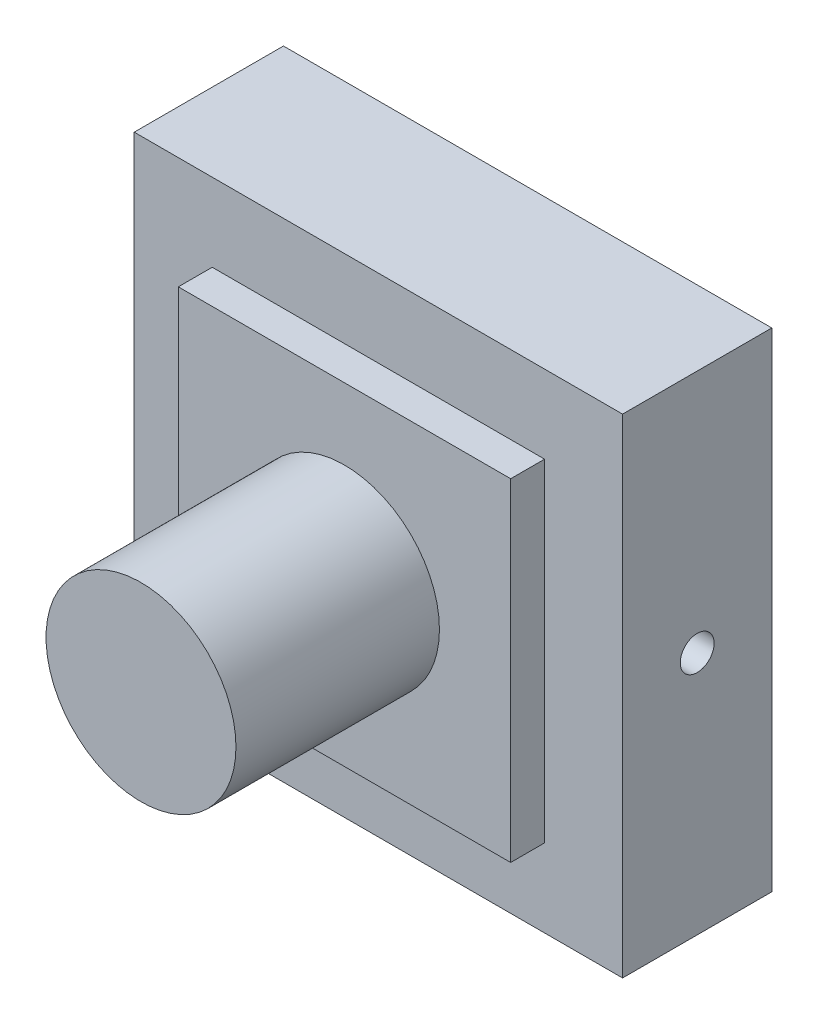
ISO-10303-21;
HEADER;
FILE_DESCRIPTION(('STEP AP214'),'2;1');
FILE_NAME('part.step','',(''),(''),'','','');
FILE_SCHEMA(('AUTOMOTIVE_DESIGN { 1 0 10303 214 1 1 1 1 }'));
ENDSEC;
DATA;
#1=APPLICATION_CONTEXT('core data for automotive mechanical design processes');
#2=APPLICATION_PROTOCOL_DEFINITION('international standard','automotive_design',2000,#1);
#3=PRODUCT_CONTEXT('',#1,'mechanical');
#4=PRODUCT('Part','Part','',(#3));
#5=PRODUCT_RELATED_PRODUCT_CATEGORY('part','',(#4));
#6=PRODUCT_DEFINITION_FORMATION('','',#4);
#7=PRODUCT_DEFINITION_CONTEXT('part definition',#1,'design');
#8=PRODUCT_DEFINITION('design','',#6,#7);
#9=PRODUCT_DEFINITION_SHAPE('','',#8);
#10=(LENGTH_UNIT() NAMED_UNIT(*) SI_UNIT(.MILLI.,.METRE.));
#11=(NAMED_UNIT(*) PLANE_ANGLE_UNIT() SI_UNIT($,.RADIAN.));
#12=(NAMED_UNIT(*) SI_UNIT($,.STERADIAN.) SOLID_ANGLE_UNIT());
#13=UNCERTAINTY_MEASURE_WITH_UNIT(LENGTH_MEASURE(1.E-05),#10,'distance_accuracy_value','');
#14=(GEOMETRIC_REPRESENTATION_CONTEXT(3) GLOBAL_UNCERTAINTY_ASSIGNED_CONTEXT((#13)) GLOBAL_UNIT_ASSIGNED_CONTEXT((#10,
#11,#12)) REPRESENTATION_CONTEXT('',''));
#15=CARTESIAN_POINT('',(0.,0.,0.));
#16=DIRECTION('',(0.,0.,1.));
#17=DIRECTION('',(1.,0.,0.));
#18=AXIS2_PLACEMENT_3D('',#15,#16,#17);
#19=CARTESIAN_POINT('',(0.,0.,11.));
#20=DIRECTION('',(0.,0.,-1.));
#21=DIRECTION('',(-1.,0.,0.));
#22=AXIS2_PLACEMENT_3D('',#19,#20,#21);
#23=PLANE('',#22);
#24=DIRECTION('',(0.,1.,0.));
#25=VECTOR('',#24,1.);
#26=CARTESIAN_POINT('',(18.,-18.,11.));
#27=LINE('',#26,#25);
#28=CARTESIAN_POINT('',(18.,-18.,11.));
#29=VERTEX_POINT('',#28);
#30=CARTESIAN_POINT('',(18.,18.,11.));
#31=VERTEX_POINT('',#30);
#32=EDGE_CURVE('E130',#29,#31,#27,.T.);
#33=ORIENTED_EDGE('',*,*,#32,.T.);
#34=DIRECTION('',(-1.,0.,0.));
#35=VECTOR('',#34,1.);
#36=CARTESIAN_POINT('',(-18.,18.,11.));
#37=LINE('',#36,#35);
#38=CARTESIAN_POINT('',(-18.,18.,11.));
#39=VERTEX_POINT('',#38);
#40=EDGE_CURVE('E133',#31,#39,#37,.T.);
#41=ORIENTED_EDGE('',*,*,#40,.T.);
#42=DIRECTION('',(0.,-1.,0.));
#43=VECTOR('',#42,1.);
#44=CARTESIAN_POINT('',(-18.,-18.,11.));
#45=LINE('',#44,#43);
#46=CARTESIAN_POINT('',(-18.,-18.,11.));
#47=VERTEX_POINT('',#46);
#48=EDGE_CURVE('E136',#39,#47,#45,.T.);
#49=ORIENTED_EDGE('',*,*,#48,.T.);
#50=DIRECTION('',(1.,0.,0.));
#51=VECTOR('',#50,1.);
#52=CARTESIAN_POINT('',(-18.,-18.,11.));
#53=LINE('',#52,#51);
#54=EDGE_CURVE('E138',#47,#29,#53,.T.);
#55=ORIENTED_EDGE('',*,*,#54,.T.);
#56=EDGE_LOOP('',(#33,#41,#49,#55));
#57=FACE_BOUND('',#56,.T.);
#58=DIRECTION('',(0.,1.,0.));
#59=VECTOR('',#58,1.);
#60=CARTESIAN_POINT('',(12.25,12.25,11.));
#61=LINE('',#60,#59);
#62=CARTESIAN_POINT('',(12.25,-12.25,11.));
#63=VERTEX_POINT('',#62);
#64=CARTESIAN_POINT('',(12.25,12.25,11.));
#65=VERTEX_POINT('',#64);
#66=EDGE_CURVE('E120',#63,#65,#61,.T.);
#67=ORIENTED_EDGE('',*,*,#66,.F.);
#68=DIRECTION('',(1.,0.,0.));
#69=VECTOR('',#68,1.);
#70=CARTESIAN_POINT('',(-12.25,-12.25,11.));
#71=LINE('',#70,#69);
#72=CARTESIAN_POINT('',(-12.25,-12.25,11.));
#73=VERTEX_POINT('',#72);
#74=EDGE_CURVE('E117',#73,#63,#71,.T.);
#75=ORIENTED_EDGE('',*,*,#74,.F.);
#76=DIRECTION('',(0.,-1.,0.));
#77=VECTOR('',#76,1.);
#78=CARTESIAN_POINT('',(-12.25,12.25,11.));
#79=LINE('',#78,#77);
#80=CARTESIAN_POINT('',(-12.25,12.25,11.));
#81=VERTEX_POINT('',#80);
#82=EDGE_CURVE('E55',#81,#73,#79,.T.);
#83=ORIENTED_EDGE('',*,*,#82,.F.);
#84=DIRECTION('',(-1.,0.,0.));
#85=VECTOR('',#84,1.);
#86=CARTESIAN_POINT('',(-12.25,12.25,11.));
#87=LINE('',#86,#85);
#88=EDGE_CURVE('E50',#65,#81,#87,.T.);
#89=ORIENTED_EDGE('',*,*,#88,.F.);
#90=EDGE_LOOP('',(#67,#75,#83,#89));
#91=FACE_BOUND('',#90,.T.);
#92=ADVANCED_FACE('F35',(#57,#91),#23,.F.);
#93=CARTESIAN_POINT('',(18.,-18.,11.));
#94=DIRECTION('',(-1.,0.,0.));
#95=DIRECTION('',(0.,0.,1.));
#96=AXIS2_PLACEMENT_3D('',#93,#94,#95);
#97=PLANE('',#96);
#98=CARTESIAN_POINT('',(18.,0.,5.5));
#99=DIRECTION('',(1.,0.,0.));
#100=DIRECTION('',(0.,0.,-1.));
#101=AXIS2_PLACEMENT_3D('',#98,#99,#100);
#102=CIRCLE('',#101,1.25);
#103=CARTESIAN_POINT('',(18.,0.,4.25));
#104=VERTEX_POINT('',#103);
#105=EDGE_CURVE('E299',#104,#104,#102,.T.);
#106=ORIENTED_EDGE('',*,*,#105,.F.);
#107=EDGE_LOOP('',(#106));
#108=FACE_BOUND('',#107,.T.);
#109=DIRECTION('',(0.,1.,0.));
#110=VECTOR('',#109,1.);
#111=CARTESIAN_POINT('',(18.,-18.,0.));
#112=LINE('',#111,#110);
#113=CARTESIAN_POINT('',(18.,-18.,0.));
#114=VERTEX_POINT('',#113);
#115=CARTESIAN_POINT('',(18.,18.,0.));
#116=VERTEX_POINT('',#115);
#117=EDGE_CURVE('E121',#114,#116,#112,.T.);
#118=ORIENTED_EDGE('',*,*,#117,.T.);
#119=DIRECTION('',(0.,0.,-1.));
#120=VECTOR('',#119,1.);
#121=CARTESIAN_POINT('',(18.,18.,11.));
#122=LINE('',#121,#120);
#123=EDGE_CURVE('E11',#31,#116,#122,.T.);
#124=ORIENTED_EDGE('',*,*,#123,.F.);
#125=ORIENTED_EDGE('',*,*,#32,.F.);
#126=DIRECTION('',(0.,0.,-1.));
#127=VECTOR('',#126,1.);
#128=CARTESIAN_POINT('',(18.,-18.,11.));
#129=LINE('',#128,#127);
#130=EDGE_CURVE('E139',#29,#114,#129,.T.);
#131=ORIENTED_EDGE('',*,*,#130,.T.);
#132=EDGE_LOOP('',(#118,#124,#125,#131));
#133=FACE_BOUND('',#132,.T.);
#134=ADVANCED_FACE('F37',(#108,#133),#97,.F.);
#135=CARTESIAN_POINT('',(-18.,18.,11.));
#136=DIRECTION('',(0.,-1.,0.));
#137=DIRECTION('',(0.,0.,-1.));
#138=AXIS2_PLACEMENT_3D('',#135,#136,#137);
#139=PLANE('',#138);
#140=DIRECTION('',(-1.,0.,0.));
#141=VECTOR('',#140,1.);
#142=CARTESIAN_POINT('',(-18.,18.,0.));
#143=LINE('',#142,#141);
#144=CARTESIAN_POINT('',(-18.,18.,0.));
#145=VERTEX_POINT('',#144);
#146=EDGE_CURVE('E124',#116,#145,#143,.T.);
#147=ORIENTED_EDGE('',*,*,#146,.T.);
#148=DIRECTION('',(0.,0.,-1.));
#149=VECTOR('',#148,1.);
#150=CARTESIAN_POINT('',(-18.,18.,11.));
#151=LINE('',#150,#149);
#152=EDGE_CURVE('E43',#39,#145,#151,.T.);
#153=ORIENTED_EDGE('',*,*,#152,.F.);
#154=ORIENTED_EDGE('',*,*,#40,.F.);
#155=ORIENTED_EDGE('',*,*,#123,.T.);
#156=EDGE_LOOP('',(#147,#153,#154,#155));
#157=FACE_BOUND('',#156,.T.);
#158=ADVANCED_FACE('F169',(#157),#139,.F.);
#159=CARTESIAN_POINT('',(-18.,-18.,11.));
#160=DIRECTION('',(1.,0.,0.));
#161=DIRECTION('',(0.,0.,-1.));
#162=AXIS2_PLACEMENT_3D('',#159,#160,#161);
#163=PLANE('',#162);
#164=CARTESIAN_POINT('',(-18.,0.,5.5));
#165=DIRECTION('',(1.,0.,0.));
#166=DIRECTION('',(0.,0.,-1.));
#167=AXIS2_PLACEMENT_3D('',#164,#165,#166);
#168=CIRCLE('',#167,1.24999999999999);
#169=CARTESIAN_POINT('',(-18.,0.,4.25000000000001));
#170=VERTEX_POINT('',#169);
#171=EDGE_CURVE('E296',#170,#170,#168,.T.);
#172=ORIENTED_EDGE('',*,*,#171,.T.);
#173=EDGE_LOOP('',(#172));
#174=FACE_BOUND('',#173,.T.);
#175=DIRECTION('',(0.,-1.,0.));
#176=VECTOR('',#175,1.);
#177=CARTESIAN_POINT('',(-18.,-18.,0.));
#178=LINE('',#177,#176);
#179=CARTESIAN_POINT('',(-18.,-18.,0.));
#180=VERTEX_POINT('',#179);
#181=EDGE_CURVE('E142',#145,#180,#178,.T.);
#182=ORIENTED_EDGE('',*,*,#181,.T.);
#183=DIRECTION('',(0.,0.,-1.));
#184=VECTOR('',#183,1.);
#185=CARTESIAN_POINT('',(-18.,-18.,11.));
#186=LINE('',#185,#184);
#187=EDGE_CURVE('E147',#47,#180,#186,.T.);
#188=ORIENTED_EDGE('',*,*,#187,.F.);
#189=ORIENTED_EDGE('',*,*,#48,.F.);
#190=ORIENTED_EDGE('',*,*,#152,.T.);
#191=EDGE_LOOP('',(#182,#188,#189,#190));
#192=FACE_BOUND('',#191,.T.);
#193=ADVANCED_FACE('F154',(#174,#192),#163,.F.);
#194=CARTESIAN_POINT('',(-18.,-18.,11.));
#195=DIRECTION('',(0.,1.,0.));
#196=DIRECTION('',(0.,0.,1.));
#197=AXIS2_PLACEMENT_3D('',#194,#195,#196);
#198=PLANE('',#197);
#199=DIRECTION('',(1.,0.,0.));
#200=VECTOR('',#199,1.);
#201=CARTESIAN_POINT('',(-18.,-18.,0.));
#202=LINE('',#201,#200);
#203=EDGE_CURVE('E134',#180,#114,#202,.T.);
#204=ORIENTED_EDGE('',*,*,#203,.T.);
#205=ORIENTED_EDGE('',*,*,#130,.F.);
#206=ORIENTED_EDGE('',*,*,#54,.F.);
#207=ORIENTED_EDGE('',*,*,#187,.T.);
#208=EDGE_LOOP('',(#204,#205,#206,#207));
#209=FACE_BOUND('',#208,.T.);
#210=ADVANCED_FACE('F163',(#209),#198,.F.);
#211=CARTESIAN_POINT('',(0.,0.,0.));
#212=DIRECTION('',(0.,0.,-1.));
#213=DIRECTION('',(-1.,0.,0.));
#214=AXIS2_PLACEMENT_3D('',#211,#212,#213);
#215=PLANE('',#214);
#216=ORIENTED_EDGE('',*,*,#117,.F.);
#217=ORIENTED_EDGE('',*,*,#203,.F.);
#218=ORIENTED_EDGE('',*,*,#181,.F.);
#219=ORIENTED_EDGE('',*,*,#146,.F.);
#220=EDGE_LOOP('',(#216,#217,#218,#219));
#221=FACE_BOUND('',#220,.T.);
#222=ADVANCED_FACE('F160',(#221),#215,.T.);
#223=CARTESIAN_POINT('',(12.25,12.25,13.5));
#224=DIRECTION('',(-1.,0.,0.));
#225=DIRECTION('',(0.,-1.,0.));
#226=AXIS2_PLACEMENT_3D('',#223,#224,#225);
#227=PLANE('',#226);
#228=ORIENTED_EDGE('',*,*,#66,.T.);
#229=DIRECTION('',(0.,0.,-1.));
#230=VECTOR('',#229,1.);
#231=CARTESIAN_POINT('',(12.25,12.25,13.5));
#232=LINE('',#231,#230);
#233=CARTESIAN_POINT('',(12.25,12.25,13.5));
#234=VERTEX_POINT('',#233);
#235=EDGE_CURVE('E101',#234,#65,#232,.T.);
#236=ORIENTED_EDGE('',*,*,#235,.F.);
#237=DIRECTION('',(0.,1.,0.));
#238=VECTOR('',#237,1.);
#239=CARTESIAN_POINT('',(12.25,12.25,13.5));
#240=LINE('',#239,#238);
#241=CARTESIAN_POINT('',(12.25,-12.25,13.5));
#242=VERTEX_POINT('',#241);
#243=EDGE_CURVE('E108',#242,#234,#240,.T.);
#244=ORIENTED_EDGE('',*,*,#243,.F.);
#245=DIRECTION('',(0.,0.,-1.));
#246=VECTOR('',#245,1.);
#247=CARTESIAN_POINT('',(12.25,-12.25,13.5));
#248=LINE('',#247,#246);
#249=EDGE_CURVE('E311',#242,#63,#248,.T.);
#250=ORIENTED_EDGE('',*,*,#249,.T.);
#251=EDGE_LOOP('',(#228,#236,#244,#250));
#252=FACE_BOUND('',#251,.T.);
#253=ADVANCED_FACE('F119',(#252),#227,.F.);
#254=CARTESIAN_POINT('',(-12.25,12.25,13.5));
#255=DIRECTION('',(0.,-1.,0.));
#256=DIRECTION('',(0.,0.,-1.));
#257=AXIS2_PLACEMENT_3D('',#254,#255,#256);
#258=PLANE('',#257);
#259=ORIENTED_EDGE('',*,*,#88,.T.);
#260=DIRECTION('',(0.,0.,-1.));
#261=VECTOR('',#260,1.);
#262=CARTESIAN_POINT('',(-12.25,12.25,13.5));
#263=LINE('',#262,#261);
#264=CARTESIAN_POINT('',(-12.25,12.25,13.5));
#265=VERTEX_POINT('',#264);
#266=EDGE_CURVE('E104',#265,#81,#263,.T.);
#267=ORIENTED_EDGE('',*,*,#266,.F.);
#268=DIRECTION('',(-1.,0.,0.));
#269=VECTOR('',#268,1.);
#270=CARTESIAN_POINT('',(-12.25,12.25,13.5));
#271=LINE('',#270,#269);
#272=EDGE_CURVE('E97',#234,#265,#271,.T.);
#273=ORIENTED_EDGE('',*,*,#272,.F.);
#274=ORIENTED_EDGE('',*,*,#235,.T.);
#275=EDGE_LOOP('',(#259,#267,#273,#274));
#276=FACE_BOUND('',#275,.T.);
#277=ADVANCED_FACE('F99',(#276),#258,.F.);
#278=CARTESIAN_POINT('',(-12.25,12.25,13.5));
#279=DIRECTION('',(1.,0.,0.));
#280=DIRECTION('',(0.,1.,0.));
#281=AXIS2_PLACEMENT_3D('',#278,#279,#280);
#282=PLANE('',#281);
#283=ORIENTED_EDGE('',*,*,#82,.T.);
#284=DIRECTION('',(0.,0.,-1.));
#285=VECTOR('',#284,1.);
#286=CARTESIAN_POINT('',(-12.25,-12.25,13.5));
#287=LINE('',#286,#285);
#288=CARTESIAN_POINT('',(-12.25,-12.25,13.5));
#289=VERTEX_POINT('',#288);
#290=EDGE_CURVE('E126',#289,#73,#287,.T.);
#291=ORIENTED_EDGE('',*,*,#290,.F.);
#292=DIRECTION('',(0.,-1.,0.));
#293=VECTOR('',#292,1.);
#294=CARTESIAN_POINT('',(-12.25,12.25,13.5));
#295=LINE('',#294,#293);
#296=EDGE_CURVE('E107',#265,#289,#295,.T.);
#297=ORIENTED_EDGE('',*,*,#296,.F.);
#298=ORIENTED_EDGE('',*,*,#266,.T.);
#299=EDGE_LOOP('',(#283,#291,#297,#298));
#300=FACE_BOUND('',#299,.T.);
#301=ADVANCED_FACE('F207',(#300),#282,.F.);
#302=CARTESIAN_POINT('',(-12.25,-12.25,13.5));
#303=DIRECTION('',(0.,1.,0.));
#304=DIRECTION('',(0.,0.,1.));
#305=AXIS2_PLACEMENT_3D('',#302,#303,#304);
#306=PLANE('',#305);
#307=ORIENTED_EDGE('',*,*,#74,.T.);
#308=ORIENTED_EDGE('',*,*,#249,.F.);
#309=DIRECTION('',(1.,0.,0.));
#310=VECTOR('',#309,1.);
#311=CARTESIAN_POINT('',(-12.25,-12.25,13.5));
#312=LINE('',#311,#310);
#313=EDGE_CURVE('E113',#289,#242,#312,.T.);
#314=ORIENTED_EDGE('',*,*,#313,.F.);
#315=ORIENTED_EDGE('',*,*,#290,.T.);
#316=EDGE_LOOP('',(#307,#308,#314,#315));
#317=FACE_BOUND('',#316,.T.);
#318=ADVANCED_FACE('F213',(#317),#306,.F.);
#319=CARTESIAN_POINT('',(0.,0.,13.5));
#320=DIRECTION('',(0.,0.,1.));
#321=DIRECTION('',(1.,0.,0.));
#322=AXIS2_PLACEMENT_3D('',#319,#320,#321);
#323=PLANE('',#322);
#324=CARTESIAN_POINT('',(0.,0.,13.5));
#325=DIRECTION('',(0.,0.,1.));
#326=DIRECTION('',(1.,0.,0.));
#327=AXIS2_PLACEMENT_3D('',#324,#325,#326);
#328=CIRCLE('',#327,7.);
#329=CARTESIAN_POINT('',(7.,0.,13.5));
#330=VERTEX_POINT('',#329);
#331=EDGE_CURVE('E301',#330,#330,#328,.T.);
#332=ORIENTED_EDGE('',*,*,#331,.F.);
#333=EDGE_LOOP('',(#332));
#334=FACE_BOUND('',#333,.T.);
#335=ORIENTED_EDGE('',*,*,#243,.T.);
#336=ORIENTED_EDGE('',*,*,#272,.T.);
#337=ORIENTED_EDGE('',*,*,#296,.T.);
#338=ORIENTED_EDGE('',*,*,#313,.T.);
#339=EDGE_LOOP('',(#335,#336,#337,#338));
#340=FACE_BOUND('',#339,.T.);
#341=ADVANCED_FACE('F111',(#334,#340),#323,.T.);
#342=CARTESIAN_POINT('',(0.,0.,28.5));
#343=DIRECTION('',(0.,0.,-1.));
#344=DIRECTION('',(-1.,0.,0.));
#345=AXIS2_PLACEMENT_3D('',#342,#343,#344);
#346=CYLINDRICAL_SURFACE('',#345,7.);
#347=CARTESIAN_POINT('',(0.,0.,28.5));
#348=DIRECTION('',(0.,0.,1.));
#349=DIRECTION('',(1.,0.,0.));
#350=AXIS2_PLACEMENT_3D('',#347,#348,#349);
#351=CIRCLE('',#350,7.);
#352=CARTESIAN_POINT('',(7.,0.,28.5));
#353=VERTEX_POINT('',#352);
#354=EDGE_CURVE('E304',#353,#353,#351,.T.);
#355=ORIENTED_EDGE('',*,*,#354,.F.);
#356=EDGE_LOOP('',(#355));
#357=FACE_BOUND('',#356,.T.);
#358=ORIENTED_EDGE('',*,*,#331,.T.);
#359=EDGE_LOOP('',(#358));
#360=FACE_BOUND('',#359,.T.);
#361=ADVANCED_FACE('F228',(#357,#360),#346,.T.);
#362=CARTESIAN_POINT('',(0.,0.,28.5));
#363=DIRECTION('',(0.,0.,1.));
#364=DIRECTION('',(1.,0.,0.));
#365=AXIS2_PLACEMENT_3D('',#362,#363,#364);
#366=PLANE('',#365);
#367=ORIENTED_EDGE('',*,*,#354,.T.);
#368=EDGE_LOOP('',(#367));
#369=FACE_BOUND('',#368,.T.);
#370=ADVANCED_FACE('F236',(#369),#366,.T.);
#371=CARTESIAN_POINT('',(18.,0.,5.5));
#372=DIRECTION('',(1.,0.,0.));
#373=DIRECTION('',(0.,0.,-1.));
#374=AXIS2_PLACEMENT_3D('',#371,#372,#373);
#375=CYLINDRICAL_SURFACE('',#374,1.24999999999999);
#376=ORIENTED_EDGE('',*,*,#171,.F.);
#377=EDGE_LOOP('',(#376));
#378=FACE_BOUND('',#377,.T.);
#379=ORIENTED_EDGE('',*,*,#105,.T.);
#380=EDGE_LOOP('',(#379));
#381=FACE_BOUND('',#380,.T.);
#382=ADVANCED_FACE('F244',(#378,#381),#375,.F.);
#383=CLOSED_SHELL('',(#92,#134,#158,#193,#210,#222,#253,#277,#301,#318,#341,#361,#370,#382));
#384=MANIFOLD_SOLID_BREP('B2',#383);
#385=ADVANCED_BREP_SHAPE_REPRESENTATION('',(#18,#384),#14);
#386=SHAPE_DEFINITION_REPRESENTATION(#9,#385);
ENDSEC;
END-ISO-10303-21;
